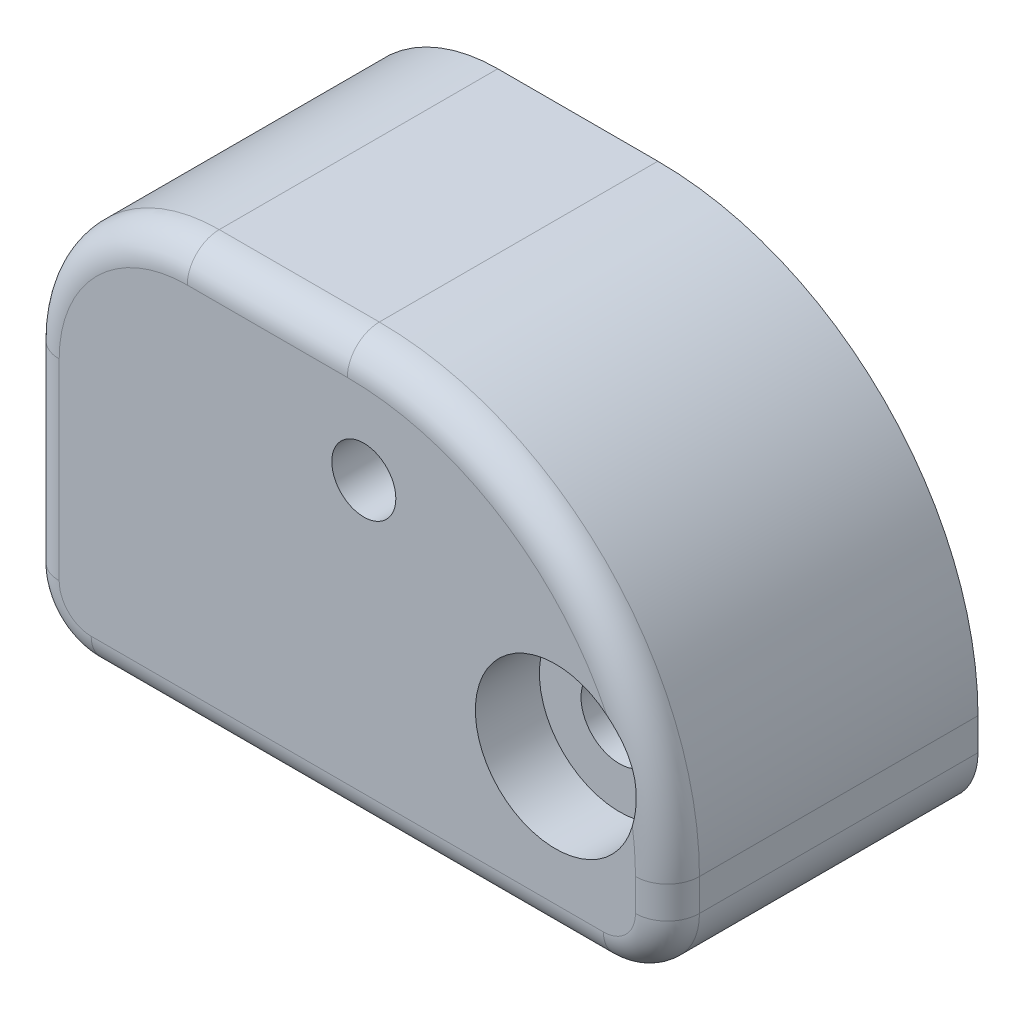
ISO-10303-21;
HEADER;
FILE_DESCRIPTION(('STEP AP214'),'2;1');
FILE_NAME('part.step','',(''),(''),'','','');
FILE_SCHEMA(('AUTOMOTIVE_DESIGN { 1 0 10303 214 1 1 1 1 }'));
ENDSEC;
DATA;
#1=APPLICATION_CONTEXT('core data for automotive mechanical design processes');
#2=APPLICATION_PROTOCOL_DEFINITION('international standard','automotive_design',2000,#1);
#3=PRODUCT_CONTEXT('',#1,'mechanical');
#4=PRODUCT('Part','Part','',(#3));
#5=PRODUCT_RELATED_PRODUCT_CATEGORY('part','',(#4));
#6=PRODUCT_DEFINITION_FORMATION('','',#4);
#7=PRODUCT_DEFINITION_CONTEXT('part definition',#1,'design');
#8=PRODUCT_DEFINITION('design','',#6,#7);
#9=PRODUCT_DEFINITION_SHAPE('','',#8);
#10=(LENGTH_UNIT() NAMED_UNIT(*) SI_UNIT(.MILLI.,.METRE.));
#11=(NAMED_UNIT(*) PLANE_ANGLE_UNIT() SI_UNIT($,.RADIAN.));
#12=(NAMED_UNIT(*) SI_UNIT($,.STERADIAN.) SOLID_ANGLE_UNIT());
#13=UNCERTAINTY_MEASURE_WITH_UNIT(LENGTH_MEASURE(1.E-05),#10,'distance_accuracy_value','');
#14=(GEOMETRIC_REPRESENTATION_CONTEXT(3) GLOBAL_UNCERTAINTY_ASSIGNED_CONTEXT((#13)) GLOBAL_UNIT_ASSIGNED_CONTEXT((#10,
#11,#12)) REPRESENTATION_CONTEXT('',''));
#15=CARTESIAN_POINT('',(0.,0.,0.));
#16=DIRECTION('',(0.,0.,1.));
#17=DIRECTION('',(1.,0.,0.));
#18=AXIS2_PLACEMENT_3D('',#15,#16,#17);
#19=CARTESIAN_POINT('',(16.5,5.,5.8));
#20=DIRECTION('',(0.,0.,-1.));
#21=DIRECTION('',(-1.,0.,0.));
#22=AXIS2_PLACEMENT_3D('',#19,#20,#21);
#23=CYLINDRICAL_SURFACE('',#22,1.2);
#24=CARTESIAN_POINT('',(16.5,5.,3.8));
#25=DIRECTION('',(0.,0.,1.));
#26=DIRECTION('',(1.,0.,0.));
#27=AXIS2_PLACEMENT_3D('',#24,#25,#26);
#28=CIRCLE('',#27,1.2);
#29=CARTESIAN_POINT('',(17.7,5.,3.8));
#30=VERTEX_POINT('',#29);
#31=EDGE_CURVE('E197',#30,#30,#28,.T.);
#32=ORIENTED_EDGE('',*,*,#31,.T.);
#33=EDGE_LOOP('',(#32));
#34=FACE_BOUND('',#33,.T.);
#35=CARTESIAN_POINT('',(16.5,5.,-3.9));
#36=DIRECTION('',(0.,0.,-1.));
#37=DIRECTION('',(-1.,0.,0.));
#38=AXIS2_PLACEMENT_3D('',#35,#36,#37);
#39=CIRCLE('',#38,1.2);
#40=CARTESIAN_POINT('',(15.3,5.,-3.9));
#41=VERTEX_POINT('',#40);
#42=EDGE_CURVE('E166',#41,#41,#39,.T.);
#43=ORIENTED_EDGE('',*,*,#42,.T.);
#44=EDGE_LOOP('',(#43));
#45=FACE_BOUND('',#44,.T.);
#46=ADVANCED_FACE('F41',(#34,#45),#23,.F.);
#47=CARTESIAN_POINT('',(0.,0.,5.8));
#48=DIRECTION('',(0.,0.,-1.));
#49=DIRECTION('',(-1.,0.,0.));
#50=AXIS2_PLACEMENT_3D('',#47,#48,#49);
#51=PLANE('',#50);
#52=CARTESIAN_POINT('',(10.5155064713713,9.48160992661595,5.8));
#53=DIRECTION('',(0.,0.,-1.));
#54=DIRECTION('',(-1.,0.,0.));
#55=AXIS2_PLACEMENT_3D('',#52,#53,#54);
#56=CIRCLE('',#55,1.);
#57=CARTESIAN_POINT('',(9.51550647137134,9.48160992661595,5.8));
#58=VERTEX_POINT('',#57);
#59=EDGE_CURVE('E169',#58,#58,#56,.T.);
#60=ORIENTED_EDGE('',*,*,#59,.T.);
#61=EDGE_LOOP('',(#60));
#62=FACE_BOUND('',#61,.T.);
#63=DIRECTION('',(0.,1.,0.));
#64=VECTOR('',#63,1.);
#65=CARTESIAN_POINT('',(19.,0.,5.8));
#66=LINE('',#65,#64);
#67=CARTESIAN_POINT('',(19.,2.,5.8));
#68=VERTEX_POINT('',#67);
#69=CARTESIAN_POINT('',(19.,3.,5.8));
#70=VERTEX_POINT('',#69);
#71=EDGE_CURVE('E226',#68,#70,#66,.T.);
#72=ORIENTED_EDGE('',*,*,#71,.T.);
#73=CARTESIAN_POINT('',(10.,3.,5.8));
#74=DIRECTION('',(0.,0.,-1.));
#75=DIRECTION('',(-1.,0.,0.));
#76=AXIS2_PLACEMENT_3D('',#73,#74,#75);
#77=CIRCLE('',#76,9.);
#78=CARTESIAN_POINT('',(18.9037240430485,4.3128968600925,5.8));
#79=VERTEX_POINT('',#78);
#80=EDGE_CURVE('E230',#70,#79,#77,.F.);
#81=ORIENTED_EDGE('',*,*,#80,.T.);
#82=CARTESIAN_POINT('',(16.5,5.,5.8));
#83=DIRECTION('',(0.,0.,1.));
#84=DIRECTION('',(1.,0.,0.));
#85=AXIS2_PLACEMENT_3D('',#82,#83,#84);
#86=CIRCLE('',#85,2.5);
#87=CARTESIAN_POINT('',(18.1016813623569,6.91953557233993,5.8));
#88=VERTEX_POINT('',#87);
#89=EDGE_CURVE('E190',#88,#79,#86,.T.);
#90=ORIENTED_EDGE('',*,*,#89,.F.);
#91=CARTESIAN_POINT('',(10.,3.,5.8));
#92=DIRECTION('',(0.,0.,-1.));
#93=DIRECTION('',(-1.,0.,0.));
#94=AXIS2_PLACEMENT_3D('',#91,#92,#93);
#95=CIRCLE('',#94,9.);
#96=CARTESIAN_POINT('',(10.,12.,5.8));
#97=VERTEX_POINT('',#96);
#98=EDGE_CURVE('E228',#88,#97,#95,.F.);
#99=ORIENTED_EDGE('',*,*,#98,.T.);
#100=DIRECTION('',(-1.,0.,0.));
#101=VECTOR('',#100,1.);
#102=CARTESIAN_POINT('',(0.,12.,5.8));
#103=LINE('',#102,#101);
#104=CARTESIAN_POINT('',(5.,12.,5.8));
#105=VERTEX_POINT('',#104);
#106=EDGE_CURVE('E214',#97,#105,#103,.T.);
#107=ORIENTED_EDGE('',*,*,#106,.T.);
#108=CARTESIAN_POINT('',(5.,8.,5.8));
#109=DIRECTION('',(0.,0.,-1.));
#110=DIRECTION('',(-1.,0.,0.));
#111=AXIS2_PLACEMENT_3D('',#108,#109,#110);
#112=CIRCLE('',#111,4.);
#113=CARTESIAN_POINT('',(1.,8.,5.8));
#114=VERTEX_POINT('',#113);
#115=EDGE_CURVE('E216',#105,#114,#112,.F.);
#116=ORIENTED_EDGE('',*,*,#115,.T.);
#117=DIRECTION('',(0.,-1.,0.));
#118=VECTOR('',#117,1.);
#119=CARTESIAN_POINT('',(1.,0.,5.8));
#120=LINE('',#119,#118);
#121=CARTESIAN_POINT('',(1.,2.,5.8));
#122=VERTEX_POINT('',#121);
#123=EDGE_CURVE('E218',#114,#122,#120,.T.);
#124=ORIENTED_EDGE('',*,*,#123,.T.);
#125=CARTESIAN_POINT('',(2.,2.,5.8));
#126=DIRECTION('',(0.,0.,-1.));
#127=DIRECTION('',(-1.,0.,0.));
#128=AXIS2_PLACEMENT_3D('',#125,#126,#127);
#129=CIRCLE('',#128,1.);
#130=CARTESIAN_POINT('',(2.,1.,5.8));
#131=VERTEX_POINT('',#130);
#132=EDGE_CURVE('E220',#122,#131,#129,.F.);
#133=ORIENTED_EDGE('',*,*,#132,.T.);
#134=DIRECTION('',(1.,0.,0.));
#135=VECTOR('',#134,1.);
#136=CARTESIAN_POINT('',(0.,1.,5.8));
#137=LINE('',#136,#135);
#138=CARTESIAN_POINT('',(18.,1.,5.8));
#139=VERTEX_POINT('',#138);
#140=EDGE_CURVE('E222',#131,#139,#137,.T.);
#141=ORIENTED_EDGE('',*,*,#140,.T.);
#142=CARTESIAN_POINT('',(18.,2.,5.8));
#143=DIRECTION('',(0.,0.,-1.));
#144=DIRECTION('',(-1.,0.,0.));
#145=AXIS2_PLACEMENT_3D('',#142,#143,#144);
#146=CIRCLE('',#145,1.);
#147=EDGE_CURVE('E224',#139,#68,#146,.F.);
#148=ORIENTED_EDGE('',*,*,#147,.T.);
#149=EDGE_LOOP('',(#72,#81,#90,#99,#107,#116,#124,#133,#141,#148));
#150=FACE_BOUND('',#149,.T.);
#151=ADVANCED_FACE('F257',(#62,#150),#51,.F.);
#152=CARTESIAN_POINT('',(20.,0.,5.8));
#153=DIRECTION('',(0.,1.,0.));
#154=DIRECTION('',(0.,0.,1.));
#155=AXIS2_PLACEMENT_3D('',#152,#153,#154);
#156=PLANE('',#155);
#157=DIRECTION('',(0.,0.,-1.));
#158=VECTOR('',#157,1.);
#159=CARTESIAN_POINT('',(18.,0.,5.8));
#160=LINE('',#159,#158);
#161=CARTESIAN_POINT('',(18.,0.,-3.9));
#162=VERTEX_POINT('',#161);
#163=CARTESIAN_POINT('',(18.,0.,4.8));
#164=VERTEX_POINT('',#163);
#165=EDGE_CURVE('E209',#162,#164,#160,.F.);
#166=ORIENTED_EDGE('',*,*,#165,.T.);
#167=DIRECTION('',(1.,0.,0.));
#168=VECTOR('',#167,1.);
#169=CARTESIAN_POINT('',(20.,0.,4.8));
#170=LINE('',#169,#168);
#171=CARTESIAN_POINT('',(2.,0.,4.8));
#172=VERTEX_POINT('',#171);
#173=EDGE_CURVE('E304',#164,#172,#170,.F.);
#174=ORIENTED_EDGE('',*,*,#173,.T.);
#175=DIRECTION('',(0.,0.,-1.));
#176=VECTOR('',#175,1.);
#177=CARTESIAN_POINT('',(2.,0.,5.8));
#178=LINE('',#177,#176);
#179=CARTESIAN_POINT('',(2.,0.,-3.9));
#180=VERTEX_POINT('',#179);
#181=EDGE_CURVE('E207',#172,#180,#178,.T.);
#182=ORIENTED_EDGE('',*,*,#181,.T.);
#183=DIRECTION('',(-1.,0.,0.));
#184=VECTOR('',#183,1.);
#185=CARTESIAN_POINT('',(18.,0.,-3.9));
#186=LINE('',#185,#184);
#187=EDGE_CURVE('E174',#162,#180,#186,.T.);
#188=ORIENTED_EDGE('',*,*,#187,.F.);
#189=EDGE_LOOP('',(#166,#174,#182,#188));
#190=FACE_BOUND('',#189,.T.);
#191=ADVANCED_FACE('F261',(#190),#156,.F.);
#192=CARTESIAN_POINT('',(20.,13.,5.8));
#193=DIRECTION('',(-1.,0.,0.));
#194=DIRECTION('',(0.,0.,1.));
#195=AXIS2_PLACEMENT_3D('',#192,#193,#194);
#196=PLANE('',#195);
#197=DIRECTION('',(0.,0.,-1.));
#198=VECTOR('',#197,1.);
#199=CARTESIAN_POINT('',(20.,3.,5.8));
#200=LINE('',#199,#198);
#201=CARTESIAN_POINT('',(20.,3.,-3.9));
#202=VERTEX_POINT('',#201);
#203=CARTESIAN_POINT('',(20.,3.,4.8));
#204=VERTEX_POINT('',#203);
#205=EDGE_CURVE('E138',#202,#204,#200,.F.);
#206=ORIENTED_EDGE('',*,*,#205,.T.);
#207=DIRECTION('',(0.,1.,0.));
#208=VECTOR('',#207,1.);
#209=CARTESIAN_POINT('',(20.,13.,4.8));
#210=LINE('',#209,#208);
#211=CARTESIAN_POINT('',(20.,2.,4.8));
#212=VERTEX_POINT('',#211);
#213=EDGE_CURVE('E332',#204,#212,#210,.F.);
#214=ORIENTED_EDGE('',*,*,#213,.T.);
#215=DIRECTION('',(0.,0.,-1.));
#216=VECTOR('',#215,1.);
#217=CARTESIAN_POINT('',(20.,2.,5.8));
#218=LINE('',#217,#216);
#219=CARTESIAN_POINT('',(20.,2.,-3.9));
#220=VERTEX_POINT('',#219);
#221=EDGE_CURVE('E154',#212,#220,#218,.T.);
#222=ORIENTED_EDGE('',*,*,#221,.T.);
#223=DIRECTION('',(0.,-1.,0.));
#224=VECTOR('',#223,1.);
#225=CARTESIAN_POINT('',(20.,3.,-3.9));
#226=LINE('',#225,#224);
#227=EDGE_CURVE('E151',#202,#220,#226,.T.);
#228=ORIENTED_EDGE('',*,*,#227,.F.);
#229=EDGE_LOOP('',(#206,#214,#222,#228));
#230=FACE_BOUND('',#229,.T.);
#231=ADVANCED_FACE('F152',(#230),#196,.F.);
#232=CARTESIAN_POINT('',(0.,13.,5.8));
#233=DIRECTION('',(0.,-1.,0.));
#234=DIRECTION('',(0.,0.,-1.));
#235=AXIS2_PLACEMENT_3D('',#232,#233,#234);
#236=PLANE('',#235);
#237=DIRECTION('',(0.,0.,-1.));
#238=VECTOR('',#237,1.);
#239=CARTESIAN_POINT('',(5.,13.,5.8));
#240=LINE('',#239,#238);
#241=CARTESIAN_POINT('',(5.,13.,-3.9));
#242=VERTEX_POINT('',#241);
#243=CARTESIAN_POINT('',(5.,13.,4.8));
#244=VERTEX_POINT('',#243);
#245=EDGE_CURVE('E204',#242,#244,#240,.F.);
#246=ORIENTED_EDGE('',*,*,#245,.T.);
#247=DIRECTION('',(-1.,0.,0.));
#248=VECTOR('',#247,1.);
#249=CARTESIAN_POINT('',(0.,13.,4.8));
#250=LINE('',#249,#248);
#251=CARTESIAN_POINT('',(10.,13.,4.8));
#252=VERTEX_POINT('',#251);
#253=EDGE_CURVE('E11',#244,#252,#250,.F.);
#254=ORIENTED_EDGE('',*,*,#253,.T.);
#255=DIRECTION('',(0.,0.,-1.));
#256=VECTOR('',#255,1.);
#257=CARTESIAN_POINT('',(10.,13.,5.8));
#258=LINE('',#257,#256);
#259=CARTESIAN_POINT('',(10.,13.,-3.9));
#260=VERTEX_POINT('',#259);
#261=EDGE_CURVE('E148',#252,#260,#258,.T.);
#262=ORIENTED_EDGE('',*,*,#261,.T.);
#263=DIRECTION('',(1.,0.,0.));
#264=VECTOR('',#263,1.);
#265=CARTESIAN_POINT('',(5.,13.,-3.9));
#266=LINE('',#265,#264);
#267=EDGE_CURVE('E165',#242,#260,#266,.T.);
#268=ORIENTED_EDGE('',*,*,#267,.F.);
#269=EDGE_LOOP('',(#246,#254,#262,#268));
#270=FACE_BOUND('',#269,.T.);
#271=ADVANCED_FACE('F265',(#270),#236,.F.);
#272=CARTESIAN_POINT('',(0.,0.,5.8));
#273=DIRECTION('',(1.,0.,0.));
#274=DIRECTION('',(0.,0.,-1.));
#275=AXIS2_PLACEMENT_3D('',#272,#273,#274);
#276=PLANE('',#275);
#277=CARTESIAN_POINT('',(0.,5.,2.8));
#278=DIRECTION('',(-1.,0.,0.));
#279=DIRECTION('',(0.,0.,1.));
#280=AXIS2_PLACEMENT_3D('',#277,#278,#279);
#281=CIRCLE('',#280,1.5);
#282=CARTESIAN_POINT('',(0.,5.,4.3));
#283=VERTEX_POINT('',#282);
#284=EDGE_CURVE('E191',#283,#283,#281,.T.);
#285=ORIENTED_EDGE('',*,*,#284,.F.);
#286=EDGE_LOOP('',(#285));
#287=FACE_BOUND('',#286,.T.);
#288=DIRECTION('',(0.,0.,-1.));
#289=VECTOR('',#288,1.);
#290=CARTESIAN_POINT('',(0.,2.,5.8));
#291=LINE('',#290,#289);
#292=CARTESIAN_POINT('',(0.,2.,-3.9));
#293=VERTEX_POINT('',#292);
#294=CARTESIAN_POINT('',(0.,2.,4.8));
#295=VERTEX_POINT('',#294);
#296=EDGE_CURVE('E212',#293,#295,#291,.F.);
#297=ORIENTED_EDGE('',*,*,#296,.T.);
#298=DIRECTION('',(0.,-1.,0.));
#299=VECTOR('',#298,1.);
#300=CARTESIAN_POINT('',(0.,0.,4.8));
#301=LINE('',#300,#299);
#302=CARTESIAN_POINT('',(0.,8.,4.8));
#303=VERTEX_POINT('',#302);
#304=EDGE_CURVE('E65',#295,#303,#301,.F.);
#305=ORIENTED_EDGE('',*,*,#304,.T.);
#306=DIRECTION('',(0.,0.,-1.));
#307=VECTOR('',#306,1.);
#308=CARTESIAN_POINT('',(0.,8.,5.8));
#309=LINE('',#308,#307);
#310=CARTESIAN_POINT('',(0.,8.,-3.9));
#311=VERTEX_POINT('',#310);
#312=EDGE_CURVE('E147',#303,#311,#309,.T.);
#313=ORIENTED_EDGE('',*,*,#312,.T.);
#314=DIRECTION('',(0.,1.,0.));
#315=VECTOR('',#314,1.);
#316=CARTESIAN_POINT('',(0.,2.,-3.9));
#317=LINE('',#316,#315);
#318=EDGE_CURVE('E180',#293,#311,#317,.T.);
#319=ORIENTED_EDGE('',*,*,#318,.F.);
#320=EDGE_LOOP('',(#297,#305,#313,#319));
#321=FACE_BOUND('',#320,.T.);
#322=ADVANCED_FACE('F252',(#287,#321),#276,.F.);
#323=CARTESIAN_POINT('',(16.5,5.,3.8));
#324=DIRECTION('',(0.,0.,1.));
#325=DIRECTION('',(1.,0.,0.));
#326=AXIS2_PLACEMENT_3D('',#323,#324,#325);
#327=CYLINDRICAL_SURFACE('',#326,2.5);
#328=CARTESIAN_POINT('',(16.5,5.,3.8));
#329=DIRECTION('',(0.,0.,1.));
#330=DIRECTION('',(1.,0.,0.));
#331=AXIS2_PLACEMENT_3D('',#328,#329,#330);
#332=CIRCLE('',#331,2.5);
#333=CARTESIAN_POINT('',(19.,5.,3.8));
#334=VERTEX_POINT('',#333);
#335=EDGE_CURVE('E194',#334,#334,#332,.T.);
#336=ORIENTED_EDGE('',*,*,#335,.F.);
#337=EDGE_LOOP('',(#336));
#338=FACE_BOUND('',#337,.T.);
#339=ORIENTED_EDGE('',*,*,#89,.T.);
#340=CARTESIAN_POINT('',(18.9037240430485,4.3128968600925,5.8));
#341=CARTESIAN_POINT('',(18.9225147472843,4.37860917370113,5.79997806164873));
#342=CARTESIAN_POINT('',(18.9385920073596,4.44507335486926,5.79880989017042));
#343=CARTESIAN_POINT('',(18.9652465521742,4.57903352155951,5.79498357553019));
#344=CARTESIAN_POINT('',(18.9758256649932,4.64652915644002,5.79232592821588));
#345=CARTESIAN_POINT('',(18.991426132249,4.78214818040288,5.78632103181125));
#346=CARTESIAN_POINT('',(18.9964455543211,4.85027177945488,5.78297354343414));
#347=CARTESIAN_POINT('',(19.0008960841657,4.98670506827679,5.77624743589748));
#348=CARTESIAN_POINT('',(19.0003267779528,5.05501477145767,5.77286881445027));
#349=CARTESIAN_POINT('',(18.993543043381,5.19250383255898,5.76658213551122));
#350=CARTESIAN_POINT('',(18.9872361044298,5.26167905982803,5.7636827126328));
#351=CARTESIAN_POINT('',(18.9688821481636,5.39929890222901,5.75886305340635));
#352=CARTESIAN_POINT('',(18.9568352161462,5.46774352820238,5.75694280250849));
#353=CARTESIAN_POINT('',(18.927088026117,5.6033744698266,5.75435993001539));
#354=CARTESIAN_POINT('',(18.9093912410517,5.67056153170951,5.75369653756591));
#355=CARTESIAN_POINT('',(18.8684686077001,5.80322789208592,5.75371907415308));
#356=CARTESIAN_POINT('',(18.8452429208678,5.86870724038579,5.75440496379251));
#357=CARTESIAN_POINT('',(18.7935878173447,5.99710345403553,5.75702092841764));
#358=CARTESIAN_POINT('',(18.7651899293235,6.06003316463716,5.75894363467852));
#359=CARTESIAN_POINT('',(18.7032926861732,6.18332661841411,5.7637525215161));
#360=CARTESIAN_POINT('',(18.6697910508203,6.24368919916493,5.76663913343173));
#361=CARTESIAN_POINT('',(18.5979510203589,6.36137848054974,5.77294064515511));
#362=CARTESIAN_POINT('',(18.5596158306085,6.41870715766416,5.7763551951986));
#363=CARTESIAN_POINT('',(18.4783405983555,6.53000576119151,5.78314463246018));
#364=CARTESIAN_POINT('',(18.4354004657965,6.58397562188522,5.78651951890115));
#365=CARTESIAN_POINT('',(18.3461019241048,6.68714677897579,5.79248802050757));
#366=CARTESIAN_POINT('',(18.2998309442685,6.73642280776825,5.79509614750627));
#367=CARTESIAN_POINT('',(18.2035203361889,6.83100340584651,5.79884026389719));
#368=CARTESIAN_POINT('',(18.153488214944,6.87631551505892,5.79997910744614));
#369=CARTESIAN_POINT('',(18.1016813623569,6.91953557233993,5.8));
#370=B_SPLINE_CURVE_WITH_KNOTS('',3,(#340,#341,#342,#343,#344,#345,#346,#347,#348,#349,#350,
#351,#352,#353,#354,#355,#356,#357,#358,#359,#360,#361,#362,#363,#364,#365,#366,#367,#368,#369),
.UNSPECIFIED.,.F.,.F.,(4,2,2,2,2,2,2,2,2,2,2,2,2,2,4),(0.,0.204940011706897,0.40981183921972,
0.614754851084399,0.819713044228357,1.02803560109633,1.23635506234244,1.44454671604668,
1.65273229092573,1.8596888800888,2.06673820481141,2.27365094047122,2.4805677233523,
2.68327034985481,2.88557862051896),.UNSPECIFIED.);
#371=EDGE_CURVE('E233',#79,#88,#370,.T.);
#372=ORIENTED_EDGE('',*,*,#371,.T.);
#373=EDGE_LOOP('',(#339,#372));
#374=FACE_BOUND('',#373,.T.);
#375=ADVANCED_FACE('F246',(#338,#374),#327,.F.);
#376=CARTESIAN_POINT('',(16.5,5.,3.8));
#377=DIRECTION('',(0.,0.,1.));
#378=DIRECTION('',(1.,0.,0.));
#379=AXIS2_PLACEMENT_3D('',#376,#377,#378);
#380=PLANE('',#379);
#381=ORIENTED_EDGE('',*,*,#31,.F.);
#382=EDGE_LOOP('',(#381));
#383=FACE_BOUND('',#382,.T.);
#384=ORIENTED_EDGE('',*,*,#335,.T.);
#385=EDGE_LOOP('',(#384));
#386=FACE_BOUND('',#385,.T.);
#387=ADVANCED_FACE('F251',(#383,#386),#380,.T.);
#388=CARTESIAN_POINT('',(10.,5.,2.8));
#389=DIRECTION('',(-1.,0.,0.));
#390=DIRECTION('',(0.,0.,1.));
#391=AXIS2_PLACEMENT_3D('',#388,#389,#390);
#392=CYLINDRICAL_SURFACE('',#391,1.5);
#393=CARTESIAN_POINT('',(10.,5.,2.8));
#394=DIRECTION('',(-1.,0.,0.));
#395=DIRECTION('',(0.,0.,1.));
#396=AXIS2_PLACEMENT_3D('',#393,#394,#395);
#397=CIRCLE('',#396,1.5);
#398=CARTESIAN_POINT('',(10.,5.,4.3));
#399=VERTEX_POINT('',#398);
#400=EDGE_CURVE('E187',#399,#399,#397,.T.);
#401=ORIENTED_EDGE('',*,*,#400,.F.);
#402=EDGE_LOOP('',(#401));
#403=FACE_BOUND('',#402,.T.);
#404=ORIENTED_EDGE('',*,*,#284,.T.);
#405=EDGE_LOOP('',(#404));
#406=FACE_BOUND('',#405,.T.);
#407=ADVANCED_FACE('F506',(#403,#406),#392,.F.);
#408=CARTESIAN_POINT('',(10.,5.,2.8));
#409=DIRECTION('',(-1.,0.,0.));
#410=DIRECTION('',(0.,0.,1.));
#411=AXIS2_PLACEMENT_3D('',#408,#409,#410);
#412=PLANE('',#411);
#413=ORIENTED_EDGE('',*,*,#400,.T.);
#414=EDGE_LOOP('',(#413));
#415=FACE_BOUND('',#414,.T.);
#416=ADVANCED_FACE('F278',(#415),#412,.T.);
#417=CARTESIAN_POINT('',(10.,3.,5.8));
#418=DIRECTION('',(0.,0.,-1.));
#419=DIRECTION('',(-1.,0.,0.));
#420=AXIS2_PLACEMENT_3D('',#417,#418,#419);
#421=CYLINDRICAL_SURFACE('',#420,10.);
#422=ORIENTED_EDGE('',*,*,#261,.F.);
#423=CARTESIAN_POINT('',(10.,3.,4.8));
#424=DIRECTION('',(0.,0.,-1.));
#425=DIRECTION('',(-1.,0.,0.));
#426=AXIS2_PLACEMENT_3D('',#423,#424,#425);
#427=CIRCLE('',#426,10.);
#428=EDGE_CURVE('E145',#252,#204,#427,.T.);
#429=ORIENTED_EDGE('',*,*,#428,.T.);
#430=ORIENTED_EDGE('',*,*,#205,.F.);
#431=CARTESIAN_POINT('',(10.,3.,-3.9));
#432=DIRECTION('',(0.,0.,-1.));
#433=DIRECTION('',(-1.,0.,0.));
#434=AXIS2_PLACEMENT_3D('',#431,#432,#433);
#435=CIRCLE('',#434,10.);
#436=EDGE_CURVE('E143',#260,#202,#435,.T.);
#437=ORIENTED_EDGE('',*,*,#436,.F.);
#438=EDGE_LOOP('',(#422,#429,#430,#437));
#439=FACE_BOUND('',#438,.T.);
#440=ADVANCED_FACE('F141',(#439),#421,.T.);
#441=CARTESIAN_POINT('',(5.,8.,5.8));
#442=DIRECTION('',(0.,0.,-1.));
#443=DIRECTION('',(-1.,0.,0.));
#444=AXIS2_PLACEMENT_3D('',#441,#442,#443);
#445=CYLINDRICAL_SURFACE('',#444,5.);
#446=ORIENTED_EDGE('',*,*,#312,.F.);
#447=CARTESIAN_POINT('',(5.,8.,4.8));
#448=DIRECTION('',(0.,0.,-1.));
#449=DIRECTION('',(-1.,0.,0.));
#450=AXIS2_PLACEMENT_3D('',#447,#448,#449);
#451=CIRCLE('',#450,5.);
#452=EDGE_CURVE('E50',#303,#244,#451,.T.);
#453=ORIENTED_EDGE('',*,*,#452,.T.);
#454=ORIENTED_EDGE('',*,*,#245,.F.);
#455=CARTESIAN_POINT('',(5.,8.,-3.9));
#456=DIRECTION('',(0.,0.,-1.));
#457=DIRECTION('',(-1.,0.,0.));
#458=AXIS2_PLACEMENT_3D('',#455,#456,#457);
#459=CIRCLE('',#458,5.);
#460=EDGE_CURVE('E183',#311,#242,#459,.T.);
#461=ORIENTED_EDGE('',*,*,#460,.F.);
#462=EDGE_LOOP('',(#446,#453,#454,#461));
#463=FACE_BOUND('',#462,.T.);
#464=ADVANCED_FACE('F277',(#463),#445,.T.);
#465=CARTESIAN_POINT('',(18.,2.,5.8));
#466=DIRECTION('',(0.,0.,-1.));
#467=DIRECTION('',(-1.,0.,0.));
#468=AXIS2_PLACEMENT_3D('',#465,#466,#467);
#469=CYLINDRICAL_SURFACE('',#468,2.);
#470=ORIENTED_EDGE('',*,*,#221,.F.);
#471=CARTESIAN_POINT('',(18.,2.,4.8));
#472=DIRECTION('',(0.,0.,-1.));
#473=DIRECTION('',(-1.,0.,0.));
#474=AXIS2_PLACEMENT_3D('',#471,#472,#473);
#475=CIRCLE('',#474,2.);
#476=EDGE_CURVE('E331',#212,#164,#475,.T.);
#477=ORIENTED_EDGE('',*,*,#476,.T.);
#478=ORIENTED_EDGE('',*,*,#165,.F.);
#479=CARTESIAN_POINT('',(18.,2.,-3.9));
#480=DIRECTION('',(0.,0.,-1.));
#481=DIRECTION('',(-1.,0.,0.));
#482=AXIS2_PLACEMENT_3D('',#479,#480,#481);
#483=CIRCLE('',#482,2.);
#484=EDGE_CURVE('E158',#220,#162,#483,.T.);
#485=ORIENTED_EDGE('',*,*,#484,.F.);
#486=EDGE_LOOP('',(#470,#477,#478,#485));
#487=FACE_BOUND('',#486,.T.);
#488=ADVANCED_FACE('F281',(#487),#469,.T.);
#489=CARTESIAN_POINT('',(2.,2.,5.8));
#490=DIRECTION('',(0.,0.,-1.));
#491=DIRECTION('',(-1.,0.,0.));
#492=AXIS2_PLACEMENT_3D('',#489,#490,#491);
#493=CYLINDRICAL_SURFACE('',#492,2.);
#494=ORIENTED_EDGE('',*,*,#181,.F.);
#495=CARTESIAN_POINT('',(2.,2.,4.8));
#496=DIRECTION('',(0.,0.,-1.));
#497=DIRECTION('',(-1.,0.,0.));
#498=AXIS2_PLACEMENT_3D('',#495,#496,#497);
#499=CIRCLE('',#498,2.);
#500=EDGE_CURVE('E295',#172,#295,#499,.T.);
#501=ORIENTED_EDGE('',*,*,#500,.T.);
#502=ORIENTED_EDGE('',*,*,#296,.F.);
#503=CARTESIAN_POINT('',(2.,2.,-3.9));
#504=DIRECTION('',(0.,0.,-1.));
#505=DIRECTION('',(-1.,0.,0.));
#506=AXIS2_PLACEMENT_3D('',#503,#504,#505);
#507=CIRCLE('',#506,2.);
#508=EDGE_CURVE('E177',#180,#293,#507,.T.);
#509=ORIENTED_EDGE('',*,*,#508,.F.);
#510=EDGE_LOOP('',(#494,#501,#502,#509));
#511=FACE_BOUND('',#510,.T.);
#512=ADVANCED_FACE('F283',(#511),#493,.T.);
#513=CARTESIAN_POINT('',(2.,2.,4.8));
#514=DIRECTION('',(0.,0.,-1.));
#515=DIRECTION('',(-1.,0.,0.));
#516=AXIS2_PLACEMENT_3D('',#513,#514,#515);
#517=DEGENERATE_TOROIDAL_SURFACE('',#516,1.,1.,.T.);
#518=CARTESIAN_POINT('',(0.999999999999998,2.,4.8));
#519=DIRECTION('',(0.,1.,0.));
#520=DIRECTION('',(0.,0.,1.));
#521=AXIS2_PLACEMENT_3D('',#518,#519,#520);
#522=CIRCLE('',#521,1.);
#523=EDGE_CURVE('E303',#295,#122,#522,.T.);
#524=ORIENTED_EDGE('',*,*,#523,.F.);
#525=ORIENTED_EDGE('',*,*,#500,.F.);
#526=CARTESIAN_POINT('',(2.,1.,4.8));
#527=DIRECTION('',(1.,0.,0.));
#528=DIRECTION('',(0.,0.,-1.));
#529=AXIS2_PLACEMENT_3D('',#526,#527,#528);
#530=CIRCLE('',#529,1.);
#531=EDGE_CURVE('E45',#131,#172,#530,.T.);
#532=ORIENTED_EDGE('',*,*,#531,.F.);
#533=ORIENTED_EDGE('',*,*,#132,.F.);
#534=EDGE_LOOP('',(#524,#525,#532,#533));
#535=FACE_BOUND('',#534,.T.);
#536=ADVANCED_FACE('F43',(#535),#517,.T.);
#537=CARTESIAN_POINT('',(0.,1.,4.8));
#538=DIRECTION('',(1.,0.,0.));
#539=DIRECTION('',(0.,0.,-1.));
#540=AXIS2_PLACEMENT_3D('',#537,#538,#539);
#541=CYLINDRICAL_SURFACE('',#540,1.);
#542=ORIENTED_EDGE('',*,*,#531,.T.);
#543=ORIENTED_EDGE('',*,*,#173,.F.);
#544=CARTESIAN_POINT('',(18.,1.,4.8));
#545=DIRECTION('',(1.,0.,0.));
#546=DIRECTION('',(0.,0.,-1.));
#547=AXIS2_PLACEMENT_3D('',#544,#545,#546);
#548=CIRCLE('',#547,1.);
#549=EDGE_CURVE('E310',#139,#164,#548,.T.);
#550=ORIENTED_EDGE('',*,*,#549,.F.);
#551=ORIENTED_EDGE('',*,*,#140,.F.);
#552=EDGE_LOOP('',(#542,#543,#550,#551));
#553=FACE_BOUND('',#552,.T.);
#554=ADVANCED_FACE('F290',(#553),#541,.T.);
#555=CARTESIAN_POINT('',(1.,0.,4.8));
#556=DIRECTION('',(0.,-1.,0.));
#557=DIRECTION('',(0.,0.,-1.));
#558=AXIS2_PLACEMENT_3D('',#555,#556,#557);
#559=CYLINDRICAL_SURFACE('',#558,1.);
#560=ORIENTED_EDGE('',*,*,#523,.T.);
#561=ORIENTED_EDGE('',*,*,#123,.F.);
#562=CARTESIAN_POINT('',(1.,8.,4.8));
#563=DIRECTION('',(0.,1.,0.));
#564=DIRECTION('',(0.,0.,1.));
#565=AXIS2_PLACEMENT_3D('',#562,#563,#564);
#566=CIRCLE('',#565,1.);
#567=EDGE_CURVE('E313',#303,#114,#566,.T.);
#568=ORIENTED_EDGE('',*,*,#567,.F.);
#569=ORIENTED_EDGE('',*,*,#304,.F.);
#570=EDGE_LOOP('',(#560,#561,#568,#569));
#571=FACE_BOUND('',#570,.T.);
#572=ADVANCED_FACE('F348',(#571),#559,.T.);
#573=CARTESIAN_POINT('',(18.,2.,4.8));
#574=DIRECTION('',(0.,0.,-1.));
#575=DIRECTION('',(-1.,0.,0.));
#576=AXIS2_PLACEMENT_3D('',#573,#574,#575);
#577=DEGENERATE_TOROIDAL_SURFACE('',#576,1.,1.,.T.);
#578=ORIENTED_EDGE('',*,*,#549,.T.);
#579=ORIENTED_EDGE('',*,*,#476,.F.);
#580=CARTESIAN_POINT('',(19.,2.,4.8));
#581=DIRECTION('',(0.,1.,0.));
#582=DIRECTION('',(0.,0.,1.));
#583=AXIS2_PLACEMENT_3D('',#580,#581,#582);
#584=CIRCLE('',#583,1.);
#585=EDGE_CURVE('E318',#68,#212,#584,.T.);
#586=ORIENTED_EDGE('',*,*,#585,.F.);
#587=ORIENTED_EDGE('',*,*,#147,.F.);
#588=EDGE_LOOP('',(#578,#579,#586,#587));
#589=FACE_BOUND('',#588,.T.);
#590=ADVANCED_FACE('F339',(#589),#577,.T.);
#591=CARTESIAN_POINT('',(5.,8.,4.8));
#592=DIRECTION('',(0.,0.,-1.));
#593=DIRECTION('',(-1.,0.,0.));
#594=AXIS2_PLACEMENT_3D('',#591,#592,#593);
#595=TOROIDAL_SURFACE('',#594,4.,1.);
#596=ORIENTED_EDGE('',*,*,#567,.T.);
#597=ORIENTED_EDGE('',*,*,#115,.F.);
#598=CARTESIAN_POINT('',(5.,12.,4.8));
#599=DIRECTION('',(1.,0.,0.));
#600=DIRECTION('',(0.,0.,-1.));
#601=AXIS2_PLACEMENT_3D('',#598,#599,#600);
#602=CIRCLE('',#601,1.);
#603=EDGE_CURVE('E321',#244,#105,#602,.T.);
#604=ORIENTED_EDGE('',*,*,#603,.F.);
#605=ORIENTED_EDGE('',*,*,#452,.F.);
#606=EDGE_LOOP('',(#596,#597,#604,#605));
#607=FACE_BOUND('',#606,.T.);
#608=ADVANCED_FACE('F350',(#607),#595,.T.);
#609=CARTESIAN_POINT('',(19.,0.,4.8));
#610=DIRECTION('',(0.,1.,0.));
#611=DIRECTION('',(0.,0.,1.));
#612=AXIS2_PLACEMENT_3D('',#609,#610,#611);
#613=CYLINDRICAL_SURFACE('',#612,1.);
#614=ORIENTED_EDGE('',*,*,#585,.T.);
#615=ORIENTED_EDGE('',*,*,#213,.F.);
#616=CARTESIAN_POINT('',(19.,3.,4.8));
#617=DIRECTION('',(0.,1.,0.));
#618=DIRECTION('',(0.,0.,1.));
#619=AXIS2_PLACEMENT_3D('',#616,#617,#618);
#620=CIRCLE('',#619,1.);
#621=EDGE_CURVE('E324',#70,#204,#620,.T.);
#622=ORIENTED_EDGE('',*,*,#621,.F.);
#623=ORIENTED_EDGE('',*,*,#71,.F.);
#624=EDGE_LOOP('',(#614,#615,#622,#623));
#625=FACE_BOUND('',#624,.T.);
#626=ADVANCED_FACE('F342',(#625),#613,.T.);
#627=CARTESIAN_POINT('',(0.,12.,4.8));
#628=DIRECTION('',(-1.,0.,0.));
#629=DIRECTION('',(0.,0.,1.));
#630=AXIS2_PLACEMENT_3D('',#627,#628,#629);
#631=CYLINDRICAL_SURFACE('',#630,1.);
#632=ORIENTED_EDGE('',*,*,#603,.T.);
#633=ORIENTED_EDGE('',*,*,#106,.F.);
#634=CARTESIAN_POINT('',(10.,12.,4.8));
#635=DIRECTION('',(1.,0.,0.));
#636=DIRECTION('',(0.,0.,-1.));
#637=AXIS2_PLACEMENT_3D('',#634,#635,#636);
#638=CIRCLE('',#637,1.);
#639=EDGE_CURVE('E186',#252,#97,#638,.T.);
#640=ORIENTED_EDGE('',*,*,#639,.F.);
#641=ORIENTED_EDGE('',*,*,#253,.F.);
#642=EDGE_LOOP('',(#632,#633,#640,#641));
#643=FACE_BOUND('',#642,.T.);
#644=ADVANCED_FACE('F356',(#643),#631,.T.);
#645=CARTESIAN_POINT('',(10.,3.,4.8));
#646=DIRECTION('',(0.,0.,-1.));
#647=DIRECTION('',(-1.,0.,0.));
#648=AXIS2_PLACEMENT_3D('',#645,#646,#647);
#649=TOROIDAL_SURFACE('',#648,9.,1.);
#650=ORIENTED_EDGE('',*,*,#621,.T.);
#651=ORIENTED_EDGE('',*,*,#428,.F.);
#652=ORIENTED_EDGE('',*,*,#639,.T.);
#653=ORIENTED_EDGE('',*,*,#98,.F.);
#654=ORIENTED_EDGE('',*,*,#371,.F.);
#655=ORIENTED_EDGE('',*,*,#80,.F.);
#656=EDGE_LOOP('',(#650,#651,#652,#653,#654,#655));
#657=FACE_BOUND('',#656,.T.);
#658=ADVANCED_FACE('F242',(#657),#649,.T.);
#659=CARTESIAN_POINT('',(10.,3.,-3.9));
#660=DIRECTION('',(0.,0.,-1.));
#661=DIRECTION('',(-1.,0.,0.));
#662=AXIS2_PLACEMENT_3D('',#659,#660,#661);
#663=PLANE('',#662);
#664=CARTESIAN_POINT('',(10.5155064713713,9.48160992661595,-3.9));
#665=DIRECTION('',(0.,0.,1.));
#666=DIRECTION('',(1.,0.,0.));
#667=AXIS2_PLACEMENT_3D('',#664,#665,#666);
#668=CIRCLE('',#667,1.);
#669=CARTESIAN_POINT('',(11.5155064713713,9.48160992661595,-3.9));
#670=VERTEX_POINT('',#669);
#671=EDGE_CURVE('E563',#670,#670,#668,.T.);
#672=ORIENTED_EDGE('',*,*,#671,.T.);
#673=EDGE_LOOP('',(#672));
#674=FACE_BOUND('',#673,.T.);
#675=ORIENTED_EDGE('',*,*,#436,.T.);
#676=ORIENTED_EDGE('',*,*,#227,.T.);
#677=ORIENTED_EDGE('',*,*,#484,.T.);
#678=ORIENTED_EDGE('',*,*,#187,.T.);
#679=ORIENTED_EDGE('',*,*,#508,.T.);
#680=ORIENTED_EDGE('',*,*,#318,.T.);
#681=ORIENTED_EDGE('',*,*,#460,.T.);
#682=ORIENTED_EDGE('',*,*,#267,.T.);
#683=EDGE_LOOP('',(#675,#676,#677,#678,#679,#680,#681,#682));
#684=FACE_BOUND('',#683,.T.);
#685=ORIENTED_EDGE('',*,*,#42,.F.);
#686=EDGE_LOOP('',(#685));
#687=FACE_BOUND('',#686,.T.);
#688=ADVANCED_FACE('F161',(#674,#684,#687),#663,.T.);
#689=CARTESIAN_POINT('',(10.5155064713713,9.48160992661595,-3.9));
#690=DIRECTION('',(0.,0.,1.));
#691=DIRECTION('',(1.,0.,0.));
#692=AXIS2_PLACEMENT_3D('',#689,#690,#691);
#693=CYLINDRICAL_SURFACE('',#692,1.);
#694=ORIENTED_EDGE('',*,*,#671,.F.);
#695=EDGE_LOOP('',(#694));
#696=FACE_BOUND('',#695,.T.);
#697=ORIENTED_EDGE('',*,*,#59,.F.);
#698=EDGE_LOOP('',(#697));
#699=FACE_BOUND('',#698,.T.);
#700=ADVANCED_FACE('F365',(#696,#699),#693,.F.);
#701=CLOSED_SHELL('',(#46,#151,#191,#231,#271,#322,#375,#387,#407,#416,#440,#464,#488,#512,#536,
#554,#572,#590,#608,#626,#644,#658,#688,#700));
#702=MANIFOLD_SOLID_BREP('B2',#701);
#703=ADVANCED_BREP_SHAPE_REPRESENTATION('',(#18,#702),#14);
#704=SHAPE_DEFINITION_REPRESENTATION(#9,#703);
ENDSEC;
END-ISO-10303-21;
